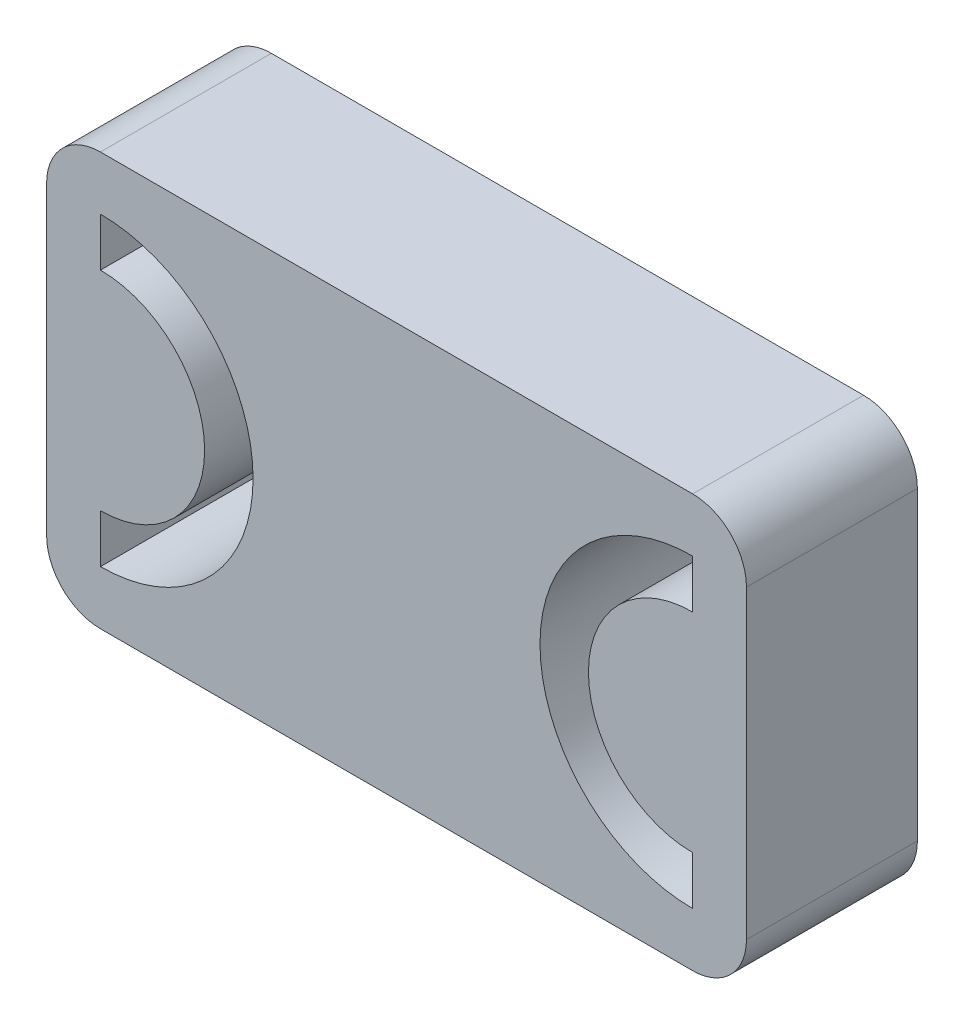
ISO-10303-21;
HEADER;
FILE_DESCRIPTION(('STEP AP214'),'2;1');
FILE_NAME('part.step','',(''),(''),'','','');
FILE_SCHEMA(('AUTOMOTIVE_DESIGN { 1 0 10303 214 1 1 1 1 }'));
ENDSEC;
DATA;
#1=APPLICATION_CONTEXT('core data for automotive mechanical design processes');
#2=APPLICATION_PROTOCOL_DEFINITION('international standard','automotive_design',2000,#1);
#3=PRODUCT_CONTEXT('',#1,'mechanical');
#4=PRODUCT('Part','Part','',(#3));
#5=PRODUCT_RELATED_PRODUCT_CATEGORY('part','',(#4));
#6=PRODUCT_DEFINITION_FORMATION('','',#4);
#7=PRODUCT_DEFINITION_CONTEXT('part definition',#1,'design');
#8=PRODUCT_DEFINITION('design','',#6,#7);
#9=PRODUCT_DEFINITION_SHAPE('','',#8);
#10=(LENGTH_UNIT() NAMED_UNIT(*) SI_UNIT(.MILLI.,.METRE.));
#11=(NAMED_UNIT(*) PLANE_ANGLE_UNIT() SI_UNIT($,.RADIAN.));
#12=(NAMED_UNIT(*) SI_UNIT($,.STERADIAN.) SOLID_ANGLE_UNIT());
#13=UNCERTAINTY_MEASURE_WITH_UNIT(LENGTH_MEASURE(1.E-05),#10,'distance_accuracy_value','');
#14=(GEOMETRIC_REPRESENTATION_CONTEXT(3) GLOBAL_UNCERTAINTY_ASSIGNED_CONTEXT((#13)) GLOBAL_UNIT_ASSIGNED_CONTEXT((#10,
#11,#12)) REPRESENTATION_CONTEXT('',''));
#15=CARTESIAN_POINT('',(0.,0.,0.));
#16=DIRECTION('',(0.,0.,1.));
#17=DIRECTION('',(1.,0.,0.));
#18=AXIS2_PLACEMENT_3D('',#15,#16,#17);
#19=CARTESIAN_POINT('',(-5.5,0.,1.5875));
#20=DIRECTION('',(0.,0.,1.));
#21=DIRECTION('',(1.,0.,0.));
#22=AXIS2_PLACEMENT_3D('',#19,#20,#21);
#23=PLANE('',#22);
#24=DIRECTION('',(1.,0.,0.));
#25=VECTOR('',#24,1.);
#26=CARTESIAN_POINT('',(-5.5,-3.835,1.5875));
#27=LINE('',#26,#25);
#28=CARTESIAN_POINT('',(-5.5,-3.835,1.5875));
#29=VERTEX_POINT('',#28);
#30=CARTESIAN_POINT('',(5.5,-3.835,1.5875));
#31=VERTEX_POINT('',#30);
#32=EDGE_CURVE('E256',#29,#31,#27,.T.);
#33=ORIENTED_EDGE('',*,*,#32,.T.);
#34=CARTESIAN_POINT('',(5.5,-2.835,1.5875));
#35=DIRECTION('',(0.,0.,1.));
#36=DIRECTION('',(1.,0.,0.));
#37=AXIS2_PLACEMENT_3D('',#34,#35,#36);
#38=CIRCLE('',#37,1.);
#39=CARTESIAN_POINT('',(6.5,-2.835,1.5875));
#40=VERTEX_POINT('',#39);
#41=EDGE_CURVE('E323',#31,#40,#38,.T.);
#42=ORIENTED_EDGE('',*,*,#41,.T.);
#43=DIRECTION('',(0.,1.,0.));
#44=VECTOR('',#43,1.);
#45=CARTESIAN_POINT('',(6.5,-1.935,1.5875));
#46=LINE('',#45,#44);
#47=CARTESIAN_POINT('',(6.5,2.835,1.5875));
#48=VERTEX_POINT('',#47);
#49=EDGE_CURVE('E260',#40,#48,#46,.T.);
#50=ORIENTED_EDGE('',*,*,#49,.T.);
#51=CARTESIAN_POINT('',(5.5,2.835,1.5875));
#52=DIRECTION('',(0.,0.,1.));
#53=DIRECTION('',(1.,0.,0.));
#54=AXIS2_PLACEMENT_3D('',#51,#52,#53);
#55=CIRCLE('',#54,1.);
#56=CARTESIAN_POINT('',(5.5,3.835,1.5875));
#57=VERTEX_POINT('',#56);
#58=EDGE_CURVE('E317',#48,#57,#55,.T.);
#59=ORIENTED_EDGE('',*,*,#58,.T.);
#60=DIRECTION('',(-1.,0.,0.));
#61=VECTOR('',#60,1.);
#62=CARTESIAN_POINT('',(-5.5,3.835,1.5875));
#63=LINE('',#62,#61);
#64=CARTESIAN_POINT('',(-5.5,3.835,1.5875));
#65=VERTEX_POINT('',#64);
#66=EDGE_CURVE('E264',#57,#65,#63,.T.);
#67=ORIENTED_EDGE('',*,*,#66,.T.);
#68=CARTESIAN_POINT('',(-5.5,2.835,1.5875));
#69=DIRECTION('',(0.,0.,1.));
#70=DIRECTION('',(1.,0.,0.));
#71=AXIS2_PLACEMENT_3D('',#68,#69,#70);
#72=CIRCLE('',#71,1.);
#73=CARTESIAN_POINT('',(-6.5,2.835,1.5875));
#74=VERTEX_POINT('',#73);
#75=EDGE_CURVE('E64',#65,#74,#72,.T.);
#76=ORIENTED_EDGE('',*,*,#75,.T.);
#77=DIRECTION('',(0.,-1.,0.));
#78=VECTOR('',#77,1.);
#79=CARTESIAN_POINT('',(-6.5,1.935,1.5875));
#80=LINE('',#79,#78);
#81=CARTESIAN_POINT('',(-6.5,-2.835,1.5875));
#82=VERTEX_POINT('',#81);
#83=EDGE_CURVE('E253',#74,#82,#80,.T.);
#84=ORIENTED_EDGE('',*,*,#83,.T.);
#85=CARTESIAN_POINT('',(-5.5,-2.835,1.5875));
#86=DIRECTION('',(0.,0.,1.));
#87=DIRECTION('',(1.,0.,0.));
#88=AXIS2_PLACEMENT_3D('',#85,#86,#87);
#89=CIRCLE('',#88,1.);
#90=EDGE_CURVE('E320',#82,#29,#89,.T.);
#91=ORIENTED_EDGE('',*,*,#90,.T.);
#92=EDGE_LOOP('',(#33,#42,#50,#59,#67,#76,#84,#91));
#93=FACE_BOUND('',#92,.T.);
#94=DIRECTION('',(0.,-1.,0.));
#95=VECTOR('',#94,1.);
#96=CARTESIAN_POINT('',(-5.5,2.83499999999999,1.5875));
#97=LINE('',#96,#95);
#98=CARTESIAN_POINT('',(-5.5,2.83499999999999,1.5875));
#99=VERTEX_POINT('',#98);
#100=CARTESIAN_POINT('',(-5.5,1.935,1.5875));
#101=VERTEX_POINT('',#100);
#102=EDGE_CURVE('E213',#99,#101,#97,.T.);
#103=ORIENTED_EDGE('',*,*,#102,.F.);
#104=CARTESIAN_POINT('',(-5.5,0.,1.5875));
#105=DIRECTION('',(0.,0.,1.));
#106=DIRECTION('',(1.,0.,0.));
#107=AXIS2_PLACEMENT_3D('',#104,#105,#106);
#108=CIRCLE('',#107,2.83499999999999);
#109=CARTESIAN_POINT('',(-5.5,-2.83499999999999,1.5875));
#110=VERTEX_POINT('',#109);
#111=EDGE_CURVE('E210',#110,#99,#108,.T.);
#112=ORIENTED_EDGE('',*,*,#111,.F.);
#113=DIRECTION('',(0.,-1.,0.));
#114=VECTOR('',#113,1.);
#115=CARTESIAN_POINT('',(-5.5,-1.935,1.5875));
#116=LINE('',#115,#114);
#117=CARTESIAN_POINT('',(-5.5,-1.935,1.5875));
#118=VERTEX_POINT('',#117);
#119=EDGE_CURVE('E221',#118,#110,#116,.T.);
#120=ORIENTED_EDGE('',*,*,#119,.F.);
#121=CARTESIAN_POINT('',(-5.5,0.,1.5875));
#122=DIRECTION('',(0.,0.,-1.));
#123=DIRECTION('',(1.,0.,0.));
#124=AXIS2_PLACEMENT_3D('',#121,#122,#123);
#125=CIRCLE('',#124,1.935);
#126=EDGE_CURVE('E217',#101,#118,#125,.T.);
#127=ORIENTED_EDGE('',*,*,#126,.F.);
#128=EDGE_LOOP('',(#103,#112,#120,#127));
#129=FACE_BOUND('',#128,.T.);
#130=DIRECTION('',(0.,1.,0.));
#131=VECTOR('',#130,1.);
#132=CARTESIAN_POINT('',(5.5,-1.935,1.5875));
#133=LINE('',#132,#131);
#134=CARTESIAN_POINT('',(5.5,-2.83499999999999,1.5875));
#135=VERTEX_POINT('',#134);
#136=CARTESIAN_POINT('',(5.5,-1.935,1.5875));
#137=VERTEX_POINT('',#136);
#138=EDGE_CURVE('E168',#135,#137,#133,.T.);
#139=ORIENTED_EDGE('',*,*,#138,.F.);
#140=CARTESIAN_POINT('',(5.5,0.,1.5875));
#141=DIRECTION('',(0.,0.,1.));
#142=DIRECTION('',(1.,0.,0.));
#143=AXIS2_PLACEMENT_3D('',#140,#141,#142);
#144=CIRCLE('',#143,2.83499999999999);
#145=CARTESIAN_POINT('',(5.5,2.83499999999999,1.5875));
#146=VERTEX_POINT('',#145);
#147=EDGE_CURVE('E157',#146,#135,#144,.T.);
#148=ORIENTED_EDGE('',*,*,#147,.F.);
#149=DIRECTION('',(0.,1.,0.));
#150=VECTOR('',#149,1.);
#151=CARTESIAN_POINT('',(5.5,2.83499999999999,1.5875));
#152=LINE('',#151,#150);
#153=CARTESIAN_POINT('',(5.5,1.935,1.5875));
#154=VERTEX_POINT('',#153);
#155=EDGE_CURVE('E186',#154,#146,#152,.T.);
#156=ORIENTED_EDGE('',*,*,#155,.F.);
#157=CARTESIAN_POINT('',(5.5,0.,1.5875));
#158=DIRECTION('',(0.,0.,-1.));
#159=DIRECTION('',(1.,0.,0.));
#160=AXIS2_PLACEMENT_3D('',#157,#158,#159);
#161=CIRCLE('',#160,1.935);
#162=EDGE_CURVE('E182',#137,#154,#161,.T.);
#163=ORIENTED_EDGE('',*,*,#162,.F.);
#164=EDGE_LOOP('',(#139,#148,#156,#163));
#165=FACE_BOUND('',#164,.T.);
#166=ADVANCED_FACE('F43',(#93,#129,#165),#23,.T.);
#167=CARTESIAN_POINT('',(-5.5,0.,-1.5875));
#168=DIRECTION('',(0.,0.,1.));
#169=DIRECTION('',(1.,0.,0.));
#170=AXIS2_PLACEMENT_3D('',#167,#168,#169);
#171=PLANE('',#170);
#172=CARTESIAN_POINT('',(-5.5,0.,-1.5875));
#173=DIRECTION('',(0.,0.,1.));
#174=DIRECTION('',(1.,0.,0.));
#175=AXIS2_PLACEMENT_3D('',#172,#173,#174);
#176=CIRCLE('',#175,2.83499999999999);
#177=CARTESIAN_POINT('',(-5.5,-2.83499999999999,-1.5875));
#178=VERTEX_POINT('',#177);
#179=CARTESIAN_POINT('',(-5.5,2.83499999999999,-1.5875));
#180=VERTEX_POINT('',#179);
#181=EDGE_CURVE('E177',#178,#180,#176,.T.);
#182=ORIENTED_EDGE('',*,*,#181,.T.);
#183=DIRECTION('',(0.,-1.,0.));
#184=VECTOR('',#183,1.);
#185=CARTESIAN_POINT('',(-5.5,2.83499999999999,-1.5875));
#186=LINE('',#185,#184);
#187=CARTESIAN_POINT('',(-5.5,1.935,-1.5875));
#188=VERTEX_POINT('',#187);
#189=EDGE_CURVE('E228',#180,#188,#186,.T.);
#190=ORIENTED_EDGE('',*,*,#189,.T.);
#191=CARTESIAN_POINT('',(-5.5,0.,-1.5875));
#192=DIRECTION('',(0.,0.,-1.));
#193=DIRECTION('',(1.,0.,0.));
#194=AXIS2_PLACEMENT_3D('',#191,#192,#193);
#195=CIRCLE('',#194,1.935);
#196=CARTESIAN_POINT('',(-5.5,-1.935,-1.5875));
#197=VERTEX_POINT('',#196);
#198=EDGE_CURVE('E232',#188,#197,#195,.T.);
#199=ORIENTED_EDGE('',*,*,#198,.T.);
#200=DIRECTION('',(0.,-1.,0.));
#201=VECTOR('',#200,1.);
#202=CARTESIAN_POINT('',(-5.5,-1.935,-1.5875));
#203=LINE('',#202,#201);
#204=EDGE_CURVE('E214',#197,#178,#203,.T.);
#205=ORIENTED_EDGE('',*,*,#204,.T.);
#206=EDGE_LOOP('',(#182,#190,#199,#205));
#207=FACE_BOUND('',#206,.T.);
#208=DIRECTION('',(0.,1.,0.));
#209=VECTOR('',#208,1.);
#210=CARTESIAN_POINT('',(6.5,3.7023269709738,-1.5875));
#211=LINE('',#210,#209);
#212=CARTESIAN_POINT('',(6.5,-2.835,-1.5875));
#213=VERTEX_POINT('',#212);
#214=CARTESIAN_POINT('',(6.5,2.835,-1.5875));
#215=VERTEX_POINT('',#214);
#216=EDGE_CURVE('E271',#213,#215,#211,.T.);
#217=ORIENTED_EDGE('',*,*,#216,.F.);
#218=CARTESIAN_POINT('',(5.5,-2.835,-1.5875));
#219=DIRECTION('',(0.,0.,1.));
#220=DIRECTION('',(1.,0.,0.));
#221=AXIS2_PLACEMENT_3D('',#218,#219,#220);
#222=CIRCLE('',#221,1.);
#223=CARTESIAN_POINT('',(5.5,-3.835,-1.5875));
#224=VERTEX_POINT('',#223);
#225=EDGE_CURVE('E312',#213,#224,#222,.F.);
#226=ORIENTED_EDGE('',*,*,#225,.T.);
#227=DIRECTION('',(1.,0.,0.));
#228=VECTOR('',#227,1.);
#229=CARTESIAN_POINT('',(-5.5,-3.835,-1.5875));
#230=LINE('',#229,#228);
#231=CARTESIAN_POINT('',(-5.5,-3.835,-1.5875));
#232=VERTEX_POINT('',#231);
#233=EDGE_CURVE('E252',#232,#224,#230,.T.);
#234=ORIENTED_EDGE('',*,*,#233,.F.);
#235=CARTESIAN_POINT('',(-5.5,-2.835,-1.5875));
#236=DIRECTION('',(0.,0.,1.));
#237=DIRECTION('',(1.,0.,0.));
#238=AXIS2_PLACEMENT_3D('',#235,#236,#237);
#239=CIRCLE('',#238,1.);
#240=CARTESIAN_POINT('',(-6.5,-2.835,-1.5875));
#241=VERTEX_POINT('',#240);
#242=EDGE_CURVE('E309',#232,#241,#239,.F.);
#243=ORIENTED_EDGE('',*,*,#242,.T.);
#244=DIRECTION('',(0.,-1.,0.));
#245=VECTOR('',#244,1.);
#246=CARTESIAN_POINT('',(-6.5,3.7023269709738,-1.5875));
#247=LINE('',#246,#245);
#248=CARTESIAN_POINT('',(-6.5,2.835,-1.5875));
#249=VERTEX_POINT('',#248);
#250=EDGE_CURVE('E257',#249,#241,#247,.T.);
#251=ORIENTED_EDGE('',*,*,#250,.F.);
#252=CARTESIAN_POINT('',(-5.5,2.835,-1.5875));
#253=DIRECTION('',(0.,0.,1.));
#254=DIRECTION('',(1.,0.,0.));
#255=AXIS2_PLACEMENT_3D('',#252,#253,#254);
#256=CIRCLE('',#255,1.);
#257=CARTESIAN_POINT('',(-5.5,3.835,-1.5875));
#258=VERTEX_POINT('',#257);
#259=EDGE_CURVE('E303',#249,#258,#256,.F.);
#260=ORIENTED_EDGE('',*,*,#259,.T.);
#261=DIRECTION('',(-1.,0.,0.));
#262=VECTOR('',#261,1.);
#263=CARTESIAN_POINT('',(-5.5,3.835,-1.5875));
#264=LINE('',#263,#262);
#265=CARTESIAN_POINT('',(5.5,3.835,-1.5875));
#266=VERTEX_POINT('',#265);
#267=EDGE_CURVE('E275',#266,#258,#264,.T.);
#268=ORIENTED_EDGE('',*,*,#267,.F.);
#269=CARTESIAN_POINT('',(5.5,2.835,-1.5875));
#270=DIRECTION('',(0.,0.,1.));
#271=DIRECTION('',(1.,0.,0.));
#272=AXIS2_PLACEMENT_3D('',#269,#270,#271);
#273=CIRCLE('',#272,1.);
#274=EDGE_CURVE('E306',#266,#215,#273,.F.);
#275=ORIENTED_EDGE('',*,*,#274,.T.);
#276=EDGE_LOOP('',(#217,#226,#234,#243,#251,#260,#268,#275));
#277=FACE_BOUND('',#276,.T.);
#278=CARTESIAN_POINT('',(5.5,0.,-1.5875));
#279=DIRECTION('',(0.,0.,1.));
#280=DIRECTION('',(1.,0.,0.));
#281=AXIS2_PLACEMENT_3D('',#278,#279,#280);
#282=CIRCLE('',#281,2.83499999999999);
#283=CARTESIAN_POINT('',(5.5,2.83499999999999,-1.5875));
#284=VERTEX_POINT('',#283);
#285=CARTESIAN_POINT('',(5.5,-2.83499999999999,-1.5875));
#286=VERTEX_POINT('',#285);
#287=EDGE_CURVE('E191',#284,#286,#282,.T.);
#288=ORIENTED_EDGE('',*,*,#287,.T.);
#289=DIRECTION('',(0.,1.,0.));
#290=VECTOR('',#289,1.);
#291=CARTESIAN_POINT('',(5.5,-1.935,-1.5875));
#292=LINE('',#291,#290);
#293=CARTESIAN_POINT('',(5.5,-1.935,-1.5875));
#294=VERTEX_POINT('',#293);
#295=EDGE_CURVE('E175',#286,#294,#292,.T.);
#296=ORIENTED_EDGE('',*,*,#295,.T.);
#297=CARTESIAN_POINT('',(5.5,0.,-1.5875));
#298=DIRECTION('',(0.,0.,-1.));
#299=DIRECTION('',(1.,0.,0.));
#300=AXIS2_PLACEMENT_3D('',#297,#298,#299);
#301=CIRCLE('',#300,1.935);
#302=CARTESIAN_POINT('',(5.5,1.935,-1.5875));
#303=VERTEX_POINT('',#302);
#304=EDGE_CURVE('E196',#294,#303,#301,.T.);
#305=ORIENTED_EDGE('',*,*,#304,.T.);
#306=DIRECTION('',(0.,1.,0.));
#307=VECTOR('',#306,1.);
#308=CARTESIAN_POINT('',(5.5,2.83499999999999,-1.5875));
#309=LINE('',#308,#307);
#310=EDGE_CURVE('E169',#303,#284,#309,.T.);
#311=ORIENTED_EDGE('',*,*,#310,.T.);
#312=EDGE_LOOP('',(#288,#296,#305,#311));
#313=FACE_BOUND('',#312,.T.);
#314=ADVANCED_FACE('F333',(#207,#277,#313),#171,.F.);
#315=CARTESIAN_POINT('',(-5.5,-3.835,1.5875));
#316=DIRECTION('',(0.,1.,0.));
#317=DIRECTION('',(0.,0.,1.));
#318=AXIS2_PLACEMENT_3D('',#315,#316,#317);
#319=PLANE('',#318);
#320=ORIENTED_EDGE('',*,*,#233,.T.);
#321=DIRECTION('',(0.,0.,-1.));
#322=VECTOR('',#321,1.);
#323=CARTESIAN_POINT('',(5.5,-3.835,1.5875));
#324=LINE('',#323,#322);
#325=EDGE_CURVE('E288',#31,#224,#324,.T.);
#326=ORIENTED_EDGE('',*,*,#325,.F.);
#327=ORIENTED_EDGE('',*,*,#32,.F.);
#328=DIRECTION('',(0.,0.,-1.));
#329=VECTOR('',#328,1.);
#330=CARTESIAN_POINT('',(-5.5,-3.835,1.5875));
#331=LINE('',#330,#329);
#332=EDGE_CURVE('E292',#29,#232,#331,.T.);
#333=ORIENTED_EDGE('',*,*,#332,.T.);
#334=EDGE_LOOP('',(#320,#326,#327,#333));
#335=FACE_BOUND('',#334,.T.);
#336=ADVANCED_FACE('F343',(#335),#319,.F.);
#337=CARTESIAN_POINT('',(6.5,3.7023269709738,1.5875));
#338=DIRECTION('',(-1.,0.,0.));
#339=DIRECTION('',(0.,0.,1.));
#340=AXIS2_PLACEMENT_3D('',#337,#338,#339);
#341=PLANE('',#340);
#342=ORIENTED_EDGE('',*,*,#49,.F.);
#343=DIRECTION('',(0.,0.,-1.));
#344=VECTOR('',#343,1.);
#345=CARTESIAN_POINT('',(6.5,-2.835,1.5875));
#346=LINE('',#345,#344);
#347=EDGE_CURVE('E299',#40,#213,#346,.T.);
#348=ORIENTED_EDGE('',*,*,#347,.T.);
#349=ORIENTED_EDGE('',*,*,#216,.T.);
#350=DIRECTION('',(0.,0.,-1.));
#351=VECTOR('',#350,1.);
#352=CARTESIAN_POINT('',(6.5,2.835,1.5875));
#353=LINE('',#352,#351);
#354=EDGE_CURVE('E296',#215,#48,#353,.F.);
#355=ORIENTED_EDGE('',*,*,#354,.T.);
#356=EDGE_LOOP('',(#342,#348,#349,#355));
#357=FACE_BOUND('',#356,.T.);
#358=ADVANCED_FACE('F352',(#357),#341,.F.);
#359=CARTESIAN_POINT('',(-5.5,3.835,1.5875));
#360=DIRECTION('',(0.,-1.,0.));
#361=DIRECTION('',(0.,0.,-1.));
#362=AXIS2_PLACEMENT_3D('',#359,#360,#361);
#363=PLANE('',#362);
#364=ORIENTED_EDGE('',*,*,#267,.T.);
#365=DIRECTION('',(0.,0.,-1.));
#366=VECTOR('',#365,1.);
#367=CARTESIAN_POINT('',(-5.5,3.835,1.5875));
#368=LINE('',#367,#366);
#369=EDGE_CURVE('E267',#65,#258,#368,.T.);
#370=ORIENTED_EDGE('',*,*,#369,.F.);
#371=ORIENTED_EDGE('',*,*,#66,.F.);
#372=DIRECTION('',(0.,0.,-1.));
#373=VECTOR('',#372,1.);
#374=CARTESIAN_POINT('',(5.5,3.835,1.5875));
#375=LINE('',#374,#373);
#376=EDGE_CURVE('E284',#57,#266,#375,.T.);
#377=ORIENTED_EDGE('',*,*,#376,.T.);
#378=EDGE_LOOP('',(#364,#370,#371,#377));
#379=FACE_BOUND('',#378,.T.);
#380=ADVANCED_FACE('F361',(#379),#363,.F.);
#381=CARTESIAN_POINT('',(-6.5,3.7023269709738,1.5875));
#382=DIRECTION('',(1.,0.,0.));
#383=DIRECTION('',(0.,0.,-1.));
#384=AXIS2_PLACEMENT_3D('',#381,#382,#383);
#385=PLANE('',#384);
#386=ORIENTED_EDGE('',*,*,#250,.T.);
#387=DIRECTION('',(0.,0.,-1.));
#388=VECTOR('',#387,1.);
#389=CARTESIAN_POINT('',(-6.5,-2.835,1.5875));
#390=LINE('',#389,#388);
#391=EDGE_CURVE('E11',#241,#82,#390,.F.);
#392=ORIENTED_EDGE('',*,*,#391,.T.);
#393=ORIENTED_EDGE('',*,*,#83,.F.);
#394=DIRECTION('',(0.,0.,-1.));
#395=VECTOR('',#394,1.);
#396=CARTESIAN_POINT('',(-6.5,2.835,1.5875));
#397=LINE('',#396,#395);
#398=EDGE_CURVE('E52',#74,#249,#397,.T.);
#399=ORIENTED_EDGE('',*,*,#398,.T.);
#400=EDGE_LOOP('',(#386,#392,#393,#399));
#401=FACE_BOUND('',#400,.T.);
#402=ADVANCED_FACE('F329',(#401),#385,.F.);
#403=CARTESIAN_POINT('',(-5.5,0.,1.5875));
#404=DIRECTION('',(0.,0.,-1.));
#405=DIRECTION('',(-1.,0.,0.));
#406=AXIS2_PLACEMENT_3D('',#403,#404,#405);
#407=CYLINDRICAL_SURFACE('',#406,2.83499999999999);
#408=ORIENTED_EDGE('',*,*,#181,.F.);
#409=DIRECTION('',(0.,0.,-1.));
#410=VECTOR('',#409,1.);
#411=CARTESIAN_POINT('',(-5.5,-2.83499999999999,1.5875));
#412=LINE('',#411,#410);
#413=EDGE_CURVE('E224',#110,#178,#412,.T.);
#414=ORIENTED_EDGE('',*,*,#413,.F.);
#415=ORIENTED_EDGE('',*,*,#111,.T.);
#416=DIRECTION('',(0.,0.,-1.));
#417=VECTOR('',#416,1.);
#418=CARTESIAN_POINT('',(-5.5,2.83499999999999,1.5875));
#419=LINE('',#418,#417);
#420=EDGE_CURVE('E248',#99,#180,#419,.T.);
#421=ORIENTED_EDGE('',*,*,#420,.T.);
#422=EDGE_LOOP('',(#408,#414,#415,#421));
#423=FACE_BOUND('',#422,.T.);
#424=ADVANCED_FACE('F374',(#423),#407,.F.);
#425=CARTESIAN_POINT('',(-5.5,2.83499999999999,1.5875));
#426=DIRECTION('',(1.,0.,0.));
#427=DIRECTION('',(0.,0.,-1.));
#428=AXIS2_PLACEMENT_3D('',#425,#426,#427);
#429=PLANE('',#428);
#430=ORIENTED_EDGE('',*,*,#189,.F.);
#431=ORIENTED_EDGE('',*,*,#420,.F.);
#432=ORIENTED_EDGE('',*,*,#102,.T.);
#433=DIRECTION('',(0.,0.,-1.));
#434=VECTOR('',#433,1.);
#435=CARTESIAN_POINT('',(-5.5,1.935,1.5875));
#436=LINE('',#435,#434);
#437=EDGE_CURVE('E245',#101,#188,#436,.T.);
#438=ORIENTED_EDGE('',*,*,#437,.T.);
#439=EDGE_LOOP('',(#430,#431,#432,#438));
#440=FACE_BOUND('',#439,.T.);
#441=ADVANCED_FACE('F469',(#440),#429,.T.);
#442=CARTESIAN_POINT('',(-5.5,0.,1.5875));
#443=DIRECTION('',(0.,0.,-1.));
#444=DIRECTION('',(-1.,0.,0.));
#445=AXIS2_PLACEMENT_3D('',#442,#443,#444);
#446=CYLINDRICAL_SURFACE('',#445,1.935);
#447=ORIENTED_EDGE('',*,*,#198,.F.);
#448=ORIENTED_EDGE('',*,*,#437,.F.);
#449=ORIENTED_EDGE('',*,*,#126,.T.);
#450=DIRECTION('',(0.,0.,-1.));
#451=VECTOR('',#450,1.);
#452=CARTESIAN_POINT('',(-5.5,-1.935,1.5875));
#453=LINE('',#452,#451);
#454=EDGE_CURVE('E242',#118,#197,#453,.T.);
#455=ORIENTED_EDGE('',*,*,#454,.T.);
#456=EDGE_LOOP('',(#447,#448,#449,#455));
#457=FACE_BOUND('',#456,.T.);
#458=ADVANCED_FACE('F459',(#457),#446,.T.);
#459=CARTESIAN_POINT('',(-5.5,-1.935,1.5875));
#460=DIRECTION('',(1.,0.,0.));
#461=DIRECTION('',(0.,0.,-1.));
#462=AXIS2_PLACEMENT_3D('',#459,#460,#461);
#463=PLANE('',#462);
#464=ORIENTED_EDGE('',*,*,#204,.F.);
#465=ORIENTED_EDGE('',*,*,#454,.F.);
#466=ORIENTED_EDGE('',*,*,#119,.T.);
#467=ORIENTED_EDGE('',*,*,#413,.T.);
#468=EDGE_LOOP('',(#464,#465,#466,#467));
#469=FACE_BOUND('',#468,.T.);
#470=ADVANCED_FACE('F450',(#469),#463,.T.);
#471=CARTESIAN_POINT('',(5.5,0.,1.5875));
#472=DIRECTION('',(0.,0.,-1.));
#473=DIRECTION('',(-1.,0.,0.));
#474=AXIS2_PLACEMENT_3D('',#471,#472,#473);
#475=CYLINDRICAL_SURFACE('',#474,2.83499999999999);
#476=ORIENTED_EDGE('',*,*,#287,.F.);
#477=DIRECTION('',(0.,0.,-1.));
#478=VECTOR('',#477,1.);
#479=CARTESIAN_POINT('',(5.5,2.83499999999999,1.5875));
#480=LINE('',#479,#478);
#481=EDGE_CURVE('E163',#146,#284,#480,.T.);
#482=ORIENTED_EDGE('',*,*,#481,.F.);
#483=ORIENTED_EDGE('',*,*,#147,.T.);
#484=DIRECTION('',(0.,0.,-1.));
#485=VECTOR('',#484,1.);
#486=CARTESIAN_POINT('',(5.5,-2.83499999999999,1.5875));
#487=LINE('',#486,#485);
#488=EDGE_CURVE('E160',#135,#286,#487,.T.);
#489=ORIENTED_EDGE('',*,*,#488,.T.);
#490=EDGE_LOOP('',(#476,#482,#483,#489));
#491=FACE_BOUND('',#490,.T.);
#492=ADVANCED_FACE('F159',(#491),#475,.F.);
#493=CARTESIAN_POINT('',(5.5,-1.935,1.5875));
#494=DIRECTION('',(-1.,0.,0.));
#495=DIRECTION('',(0.,0.,1.));
#496=AXIS2_PLACEMENT_3D('',#493,#494,#495);
#497=PLANE('',#496);
#498=ORIENTED_EDGE('',*,*,#295,.F.);
#499=ORIENTED_EDGE('',*,*,#488,.F.);
#500=ORIENTED_EDGE('',*,*,#138,.T.);
#501=DIRECTION('',(0.,0.,-1.));
#502=VECTOR('',#501,1.);
#503=CARTESIAN_POINT('',(5.5,-1.935,1.5875));
#504=LINE('',#503,#502);
#505=EDGE_CURVE('E178',#137,#294,#504,.T.);
#506=ORIENTED_EDGE('',*,*,#505,.T.);
#507=EDGE_LOOP('',(#498,#499,#500,#506));
#508=FACE_BOUND('',#507,.T.);
#509=ADVANCED_FACE('F172',(#508),#497,.T.);
#510=CARTESIAN_POINT('',(5.5,0.,1.5875));
#511=DIRECTION('',(0.,0.,-1.));
#512=DIRECTION('',(-1.,0.,0.));
#513=AXIS2_PLACEMENT_3D('',#510,#511,#512);
#514=CYLINDRICAL_SURFACE('',#513,1.935);
#515=ORIENTED_EDGE('',*,*,#304,.F.);
#516=ORIENTED_EDGE('',*,*,#505,.F.);
#517=ORIENTED_EDGE('',*,*,#162,.T.);
#518=DIRECTION('',(0.,0.,-1.));
#519=VECTOR('',#518,1.);
#520=CARTESIAN_POINT('',(5.5,1.935,1.5875));
#521=LINE('',#520,#519);
#522=EDGE_CURVE('E205',#154,#303,#521,.T.);
#523=ORIENTED_EDGE('',*,*,#522,.T.);
#524=EDGE_LOOP('',(#515,#516,#517,#523));
#525=FACE_BOUND('',#524,.T.);
#526=ADVANCED_FACE('F423',(#525),#514,.T.);
#527=CARTESIAN_POINT('',(5.5,2.83499999999999,1.5875));
#528=DIRECTION('',(-1.,0.,0.));
#529=DIRECTION('',(0.,0.,1.));
#530=AXIS2_PLACEMENT_3D('',#527,#528,#529);
#531=PLANE('',#530);
#532=ORIENTED_EDGE('',*,*,#310,.F.);
#533=ORIENTED_EDGE('',*,*,#522,.F.);
#534=ORIENTED_EDGE('',*,*,#155,.T.);
#535=ORIENTED_EDGE('',*,*,#481,.T.);
#536=EDGE_LOOP('',(#532,#533,#534,#535));
#537=FACE_BOUND('',#536,.T.);
#538=ADVANCED_FACE('F387',(#537),#531,.T.);
#539=CARTESIAN_POINT('',(5.5,-2.835,1.5875));
#540=DIRECTION('',(0.,0.,-1.));
#541=DIRECTION('',(-1.,0.,0.));
#542=AXIS2_PLACEMENT_3D('',#539,#540,#541);
#543=CYLINDRICAL_SURFACE('',#542,1.);
#544=ORIENTED_EDGE('',*,*,#41,.F.);
#545=ORIENTED_EDGE('',*,*,#325,.T.);
#546=ORIENTED_EDGE('',*,*,#225,.F.);
#547=ORIENTED_EDGE('',*,*,#347,.F.);
#548=EDGE_LOOP('',(#544,#545,#546,#547));
#549=FACE_BOUND('',#548,.T.);
#550=ADVANCED_FACE('F354',(#549),#543,.T.);
#551=CARTESIAN_POINT('',(-5.5,-2.835,1.5875));
#552=DIRECTION('',(0.,0.,-1.));
#553=DIRECTION('',(-1.,0.,0.));
#554=AXIS2_PLACEMENT_3D('',#551,#552,#553);
#555=CYLINDRICAL_SURFACE('',#554,1.);
#556=ORIENTED_EDGE('',*,*,#90,.F.);
#557=ORIENTED_EDGE('',*,*,#391,.F.);
#558=ORIENTED_EDGE('',*,*,#242,.F.);
#559=ORIENTED_EDGE('',*,*,#332,.F.);
#560=EDGE_LOOP('',(#556,#557,#558,#559));
#561=FACE_BOUND('',#560,.T.);
#562=ADVANCED_FACE('F340',(#561),#555,.T.);
#563=CARTESIAN_POINT('',(5.5,2.835,1.5875));
#564=DIRECTION('',(0.,0.,-1.));
#565=DIRECTION('',(-1.,0.,0.));
#566=AXIS2_PLACEMENT_3D('',#563,#564,#565);
#567=CYLINDRICAL_SURFACE('',#566,1.);
#568=ORIENTED_EDGE('',*,*,#58,.F.);
#569=ORIENTED_EDGE('',*,*,#354,.F.);
#570=ORIENTED_EDGE('',*,*,#274,.F.);
#571=ORIENTED_EDGE('',*,*,#376,.F.);
#572=EDGE_LOOP('',(#568,#569,#570,#571));
#573=FACE_BOUND('',#572,.T.);
#574=ADVANCED_FACE('F356',(#573),#567,.T.);
#575=CARTESIAN_POINT('',(-5.5,2.835,1.5875));
#576=DIRECTION('',(0.,0.,-1.));
#577=DIRECTION('',(-1.,0.,0.));
#578=AXIS2_PLACEMENT_3D('',#575,#576,#577);
#579=CYLINDRICAL_SURFACE('',#578,1.);
#580=ORIENTED_EDGE('',*,*,#75,.F.);
#581=ORIENTED_EDGE('',*,*,#369,.T.);
#582=ORIENTED_EDGE('',*,*,#259,.F.);
#583=ORIENTED_EDGE('',*,*,#398,.F.);
#584=EDGE_LOOP('',(#580,#581,#582,#583));
#585=FACE_BOUND('',#584,.T.);
#586=ADVANCED_FACE('F45',(#585),#579,.T.);
#587=CLOSED_SHELL('',(#166,#314,#336,#358,#380,#402,#424,#441,#458,#470,#492,#509,#526,#538,
#550,#562,#574,#586));
#588=MANIFOLD_SOLID_BREP('B2',#587);
#589=ADVANCED_BREP_SHAPE_REPRESENTATION('',(#18,#588),#14);
#590=SHAPE_DEFINITION_REPRESENTATION(#9,#589);
ENDSEC;
END-ISO-10303-21;
